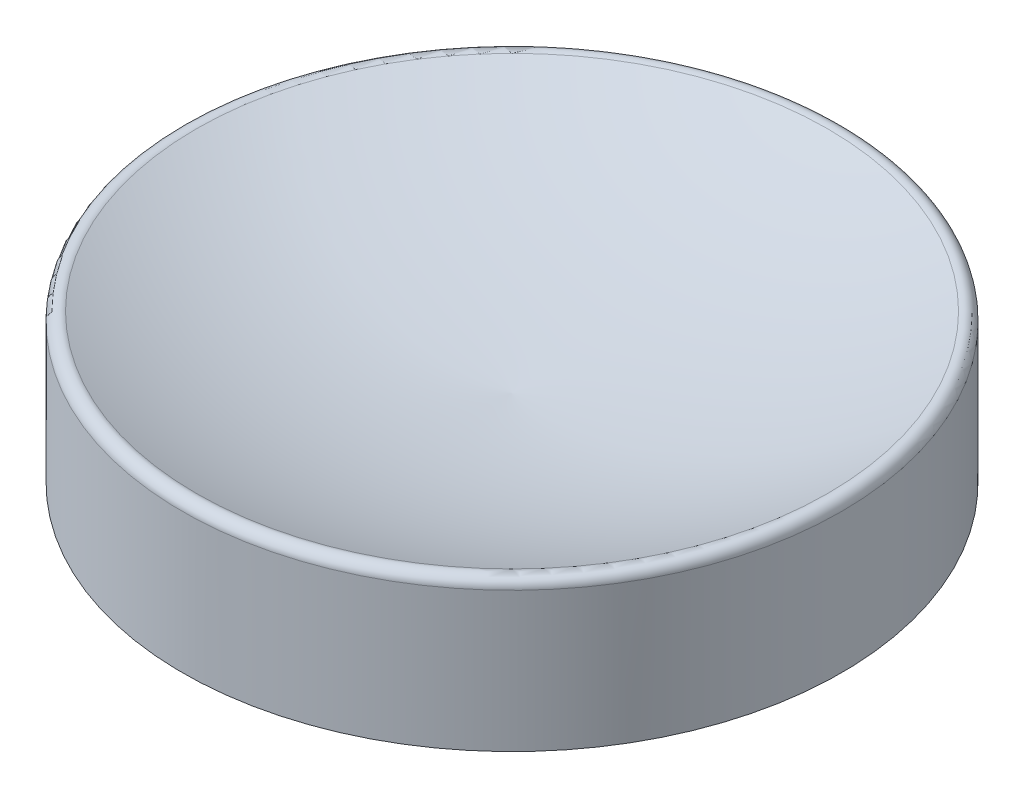
ISO-10303-21;
HEADER;
FILE_DESCRIPTION(('STEP AP214'),'2;1');
FILE_NAME('part.step','',(''),(''),'','','');
FILE_SCHEMA(('AUTOMOTIVE_DESIGN { 1 0 10303 214 1 1 1 1 }'));
ENDSEC;
DATA;
#1=APPLICATION_CONTEXT('core data for automotive mechanical design processes');
#2=APPLICATION_PROTOCOL_DEFINITION('international standard','automotive_design',2000,#1);
#3=PRODUCT_CONTEXT('',#1,'mechanical');
#4=PRODUCT('Part','Part','',(#3));
#5=PRODUCT_RELATED_PRODUCT_CATEGORY('part','',(#4));
#6=PRODUCT_DEFINITION_FORMATION('','',#4);
#7=PRODUCT_DEFINITION_CONTEXT('part definition',#1,'design');
#8=PRODUCT_DEFINITION('design','',#6,#7);
#9=PRODUCT_DEFINITION_SHAPE('','',#8);
#10=(LENGTH_UNIT() NAMED_UNIT(*) SI_UNIT(.MILLI.,.METRE.));
#11=(NAMED_UNIT(*) PLANE_ANGLE_UNIT() SI_UNIT($,.RADIAN.));
#12=(NAMED_UNIT(*) SI_UNIT($,.STERADIAN.) SOLID_ANGLE_UNIT());
#13=UNCERTAINTY_MEASURE_WITH_UNIT(LENGTH_MEASURE(1.E-05),#10,'distance_accuracy_value','');
#14=(GEOMETRIC_REPRESENTATION_CONTEXT(3) GLOBAL_UNCERTAINTY_ASSIGNED_CONTEXT((#13)) GLOBAL_UNIT_ASSIGNED_CONTEXT((#10,
#11,#12)) REPRESENTATION_CONTEXT('',''));
#15=CARTESIAN_POINT('',(0.,0.,0.));
#16=DIRECTION('',(0.,0.,1.));
#17=DIRECTION('',(1.,0.,0.));
#18=AXIS2_PLACEMENT_3D('',#15,#16,#17);
#19=CARTESIAN_POINT('',(8.5,4.,0.));
#20=CARTESIAN_POINT('',(5.47612738260417,2.51107510904068,0.));
#21=CARTESIAN_POINT('',(2.74786155583396,2.16933053200464,0.));
#22=CARTESIAN_POINT('',(0.,2.,0.));
#23=B_SPLINE_CURVE_WITH_KNOTS('',3,(#19,#20,#21,#22),.UNSPECIFIED.,.F.,.F.,(4,4),(0.,1.),.UNSPECIFIED.);
#24=CARTESIAN_POINT('',(0.,2.,0.));
#25=DIRECTION('',(0.,1.,0.));
#26=AXIS1_PLACEMENT('',#24,#25);
#27=SURFACE_OF_REVOLUTION('',#23,#26);
#28=CARTESIAN_POINT('',(0.,3.82946293532094,0.));
#29=DIRECTION('',(0.,1.,0.));
#30=DIRECTION('',(-1.,0.,0.));
#31=AXIS2_PLACEMENT_3D('',#28,#29,#30);
#32=CIRCLE('',#31,8.14430210875089);
#33=CARTESIAN_POINT('',(-8.14430210875089,3.82946293532094,0.));
#34=VERTEX_POINT('',#33);
#35=EDGE_CURVE('E74',#34,#34,#32,.T.);
#36=ORIENTED_EDGE('',*,*,#35,.T.);
#37=EDGE_LOOP('',(#36));
#38=FACE_BOUND('',#37,.T.);
#39=CARTESIAN_POINT('',(0.,2.,0.));
#40=VERTEX_POINT('',#39);
#41=VERTEX_LOOP('',#40);
#42=FACE_BOUND('',#41,.T.);
#43=ADVANCED_FACE('F39',(#38,#42),#27,.T.);
#44=CARTESIAN_POINT('',(0.,2.,0.));
#45=DIRECTION('',(0.,1.,0.));
#46=DIRECTION('',(-1.,0.,0.));
#47=AXIS2_PLACEMENT_3D('',#44,#45,#46);
#48=CYLINDRICAL_SURFACE('',#47,8.5);
#49=CARTESIAN_POINT('',(0.,3.60290619676414,0.));
#50=DIRECTION('',(0.,-1.,0.));
#51=DIRECTION('',(1.,0.,0.));
#52=AXIS2_PLACEMENT_3D('',#49,#50,#51);
#53=CIRCLE('',#52,8.5);
#54=CARTESIAN_POINT('',(8.5,3.60290619676414,0.));
#55=VERTEX_POINT('',#54);
#56=EDGE_CURVE('E43',#55,#55,#53,.T.);
#57=ORIENTED_EDGE('',*,*,#56,.T.);
#58=EDGE_LOOP('',(#57));
#59=FACE_BOUND('',#58,.T.);
#60=CARTESIAN_POINT('',(0.,0.,0.));
#61=DIRECTION('',(0.,1.,0.));
#62=DIRECTION('',(-1.,0.,0.));
#63=AXIS2_PLACEMENT_3D('',#60,#61,#62);
#64=CIRCLE('',#63,8.5);
#65=CARTESIAN_POINT('',(-8.5,0.,0.));
#66=VERTEX_POINT('',#65);
#67=EDGE_CURVE('E68',#66,#66,#64,.T.);
#68=ORIENTED_EDGE('',*,*,#67,.T.);
#69=EDGE_LOOP('',(#68));
#70=FACE_BOUND('',#69,.T.);
#71=ADVANCED_FACE('F52',(#59,#70),#48,.T.);
#72=CARTESIAN_POINT('',(0.,0.,0.));
#73=DIRECTION('',(0.,1.,0.));
#74=DIRECTION('',(-1.,0.,0.));
#75=AXIS2_PLACEMENT_3D('',#72,#73,#74);
#76=PLANE('',#75);
#77=CARTESIAN_POINT('',(0.,0.,0.));
#78=DIRECTION('',(0.,-1.,0.));
#79=DIRECTION('',(1.,0.,0.));
#80=AXIS2_PLACEMENT_3D('',#77,#78,#79);
#81=CIRCLE('',#80,3.);
#82=CARTESIAN_POINT('',(3.,0.,0.));
#83=VERTEX_POINT('',#82);
#84=EDGE_CURVE('E11',#83,#83,#81,.T.);
#85=ORIENTED_EDGE('',*,*,#84,.F.);
#86=EDGE_LOOP('',(#85));
#87=FACE_BOUND('',#86,.T.);
#88=ORIENTED_EDGE('',*,*,#67,.F.);
#89=EDGE_LOOP('',(#88));
#90=FACE_BOUND('',#89,.T.);
#91=ADVANCED_FACE('F57',(#87,#90),#76,.F.);
#92=CARTESIAN_POINT('',(0.,3.60290619676414,0.));
#93=DIRECTION('',(0.,-1.,0.));
#94=DIRECTION('',(1.,0.,0.));
#95=AXIS2_PLACEMENT_3D('',#92,#93,#94);
#96=TOROIDAL_SURFACE('',#95,8.25,0.25);
#97=ORIENTED_EDGE('',*,*,#56,.F.);
#98=EDGE_LOOP('',(#97));
#99=FACE_BOUND('',#98,.T.);
#100=ORIENTED_EDGE('',*,*,#35,.F.);
#101=EDGE_LOOP('',(#100));
#102=FACE_BOUND('',#101,.T.);
#103=ADVANCED_FACE('F41',(#99,#102),#96,.T.);
#104=CARTESIAN_POINT('',(0.,-2.,0.));
#105=DIRECTION('',(0.,1.,0.));
#106=DIRECTION('',(-1.,0.,0.));
#107=AXIS2_PLACEMENT_3D('',#104,#105,#106);
#108=CYLINDRICAL_SURFACE('',#107,3.);
#109=CARTESIAN_POINT('',(0.,-2.,0.));
#110=DIRECTION('',(0.,-1.,0.));
#111=DIRECTION('',(1.,0.,0.));
#112=AXIS2_PLACEMENT_3D('',#109,#110,#111);
#113=CIRCLE('',#112,3.);
#114=CARTESIAN_POINT('',(3.,-2.,0.));
#115=VERTEX_POINT('',#114);
#116=EDGE_CURVE('E75',#115,#115,#113,.T.);
#117=ORIENTED_EDGE('',*,*,#116,.F.);
#118=EDGE_LOOP('',(#117));
#119=FACE_BOUND('',#118,.T.);
#120=ORIENTED_EDGE('',*,*,#84,.T.);
#121=EDGE_LOOP('',(#120));
#122=FACE_BOUND('',#121,.T.);
#123=ADVANCED_FACE('F85',(#119,#122),#108,.T.);
#124=CARTESIAN_POINT('',(0.,-2.,0.));
#125=DIRECTION('',(0.,-1.,0.));
#126=DIRECTION('',(1.,0.,0.));
#127=AXIS2_PLACEMENT_3D('',#124,#125,#126);
#128=PLANE('',#127);
#129=ORIENTED_EDGE('',*,*,#116,.T.);
#130=EDGE_LOOP('',(#129));
#131=FACE_BOUND('',#130,.T.);
#132=ADVANCED_FACE('F90',(#131),#128,.T.);
#133=CLOSED_SHELL('',(#43,#71,#91,#103,#123,#132));
#134=MANIFOLD_SOLID_BREP('B2',#133);
#135=ADVANCED_BREP_SHAPE_REPRESENTATION('',(#18,#134),#14);
#136=SHAPE_DEFINITION_REPRESENTATION(#9,#135);
ENDSEC;
END-ISO-10303-21;
